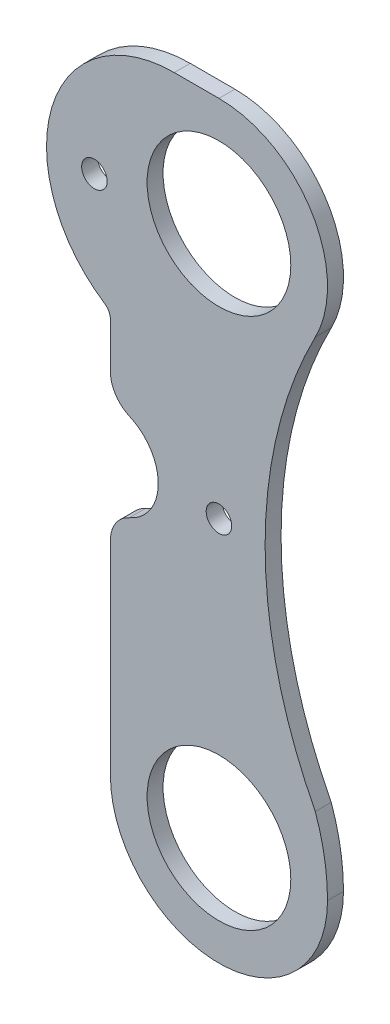
ISO-10303-21;
HEADER;
FILE_DESCRIPTION(('STEP AP214'),'2;1');
FILE_NAME('part.step','',(''),(''),'','','');
FILE_SCHEMA(('AUTOMOTIVE_DESIGN { 1 0 10303 214 1 1 1 1 }'));
ENDSEC;
DATA;
#1=APPLICATION_CONTEXT('core data for automotive mechanical design processes');
#2=APPLICATION_PROTOCOL_DEFINITION('international standard','automotive_design',2000,#1);
#3=PRODUCT_CONTEXT('',#1,'mechanical');
#4=PRODUCT('Part','Part','',(#3));
#5=PRODUCT_RELATED_PRODUCT_CATEGORY('part','',(#4));
#6=PRODUCT_DEFINITION_FORMATION('','',#4);
#7=PRODUCT_DEFINITION_CONTEXT('part definition',#1,'design');
#8=PRODUCT_DEFINITION('design','',#6,#7);
#9=PRODUCT_DEFINITION_SHAPE('','',#8);
#10=(LENGTH_UNIT() NAMED_UNIT(*) SI_UNIT(.MILLI.,.METRE.));
#11=(NAMED_UNIT(*) PLANE_ANGLE_UNIT() SI_UNIT($,.RADIAN.));
#12=(NAMED_UNIT(*) SI_UNIT($,.STERADIAN.) SOLID_ANGLE_UNIT());
#13=UNCERTAINTY_MEASURE_WITH_UNIT(LENGTH_MEASURE(1.E-05),#10,'distance_accuracy_value','');
#14=(GEOMETRIC_REPRESENTATION_CONTEXT(3) GLOBAL_UNCERTAINTY_ASSIGNED_CONTEXT((#13)) GLOBAL_UNIT_ASSIGNED_CONTEXT((#10,
#11,#12)) REPRESENTATION_CONTEXT('',''));
#15=CARTESIAN_POINT('',(0.,0.,0.));
#16=DIRECTION('',(0.,0.,1.));
#17=DIRECTION('',(1.,0.,0.));
#18=AXIS2_PLACEMENT_3D('',#15,#16,#17);
#19=CARTESIAN_POINT('',(0.,0.,3.175));
#20=DIRECTION('',(0.,0.,-1.));
#21=DIRECTION('',(-1.,0.,0.));
#22=AXIS2_PLACEMENT_3D('',#19,#20,#21);
#23=CYLINDRICAL_SURFACE('',#22,21.59);
#24=CARTESIAN_POINT('',(0.,0.,0.));
#25=DIRECTION('',(0.,0.,-1.));
#26=DIRECTION('',(-1.,0.,0.));
#27=AXIS2_PLACEMENT_3D('',#24,#25,#26);
#28=CIRCLE('',#27,21.59);
#29=CARTESIAN_POINT('',(0.,21.59,0.));
#30=VERTEX_POINT('',#29);
#31=CARTESIAN_POINT('',(19.1590830035103,-9.9527703914339,0.));
#32=VERTEX_POINT('',#31);
#33=EDGE_CURVE('E240',#30,#32,#28,.T.);
#34=ORIENTED_EDGE('',*,*,#33,.F.);
#35=DIRECTION('',(0.,0.,1.));
#36=VECTOR('',#35,1.);
#37=CARTESIAN_POINT('',(0.,21.59,0.));
#38=LINE('',#37,#36);
#39=CARTESIAN_POINT('',(0.,21.59,3.175));
#40=VERTEX_POINT('',#39);
#41=EDGE_CURVE('E221',#30,#40,#38,.T.);
#42=ORIENTED_EDGE('',*,*,#41,.T.);
#43=CARTESIAN_POINT('',(0.,0.,3.175));
#44=DIRECTION('',(0.,0.,-1.));
#45=DIRECTION('',(-1.,0.,0.));
#46=AXIS2_PLACEMENT_3D('',#43,#44,#45);
#47=CIRCLE('',#46,21.59);
#48=CARTESIAN_POINT('',(19.1590830035103,-9.9527703914339,3.175));
#49=VERTEX_POINT('',#48);
#50=EDGE_CURVE('E239',#40,#49,#47,.T.);
#51=ORIENTED_EDGE('',*,*,#50,.T.);
#52=DIRECTION('',(0.,0.,-1.));
#53=VECTOR('',#52,1.);
#54=CARTESIAN_POINT('',(19.1590830035103,-9.9527703914339,3.175));
#55=LINE('',#54,#53);
#56=EDGE_CURVE('E248',#49,#32,#55,.T.);
#57=ORIENTED_EDGE('',*,*,#56,.T.);
#58=EDGE_LOOP('',(#34,#42,#51,#57));
#59=FACE_BOUND('',#58,.T.);
#60=ADVANCED_FACE('F73',(#59),#23,.T.);
#61=CARTESIAN_POINT('',(8.89000000000001,12.7,3.175));
#62=DIRECTION('',(0.,0.,-1.));
#63=DIRECTION('',(-1.,0.,0.));
#64=AXIS2_PLACEMENT_3D('',#61,#62,#63);
#65=PLANE('',#64);
#66=CARTESIAN_POINT('',(0.,-105.77576,3.175));
#67=DIRECTION('',(0.,0.,1.));
#68=DIRECTION('',(1.,0.,0.));
#69=AXIS2_PLACEMENT_3D('',#66,#67,#68);
#70=CIRCLE('',#69,14.2875);
#71=CARTESIAN_POINT('',(14.2875,-105.77576,3.175));
#72=VERTEX_POINT('',#71);
#73=EDGE_CURVE('E354',#72,#72,#70,.T.);
#74=ORIENTED_EDGE('',*,*,#73,.F.);
#75=EDGE_LOOP('',(#74));
#76=FACE_BOUND('',#75,.T.);
#77=CARTESIAN_POINT('',(0.,-105.77576,3.175));
#78=DIRECTION('',(0.,0.,1.));
#79=DIRECTION('',(1.,0.,0.));
#80=AXIS2_PLACEMENT_3D('',#77,#78,#79);
#81=CIRCLE('',#80,21.59);
#82=CARTESIAN_POINT('',(-21.59,-105.77576,3.175));
#83=VERTEX_POINT('',#82);
#84=CARTESIAN_POINT('',(21.59,-105.77576,3.175));
#85=VERTEX_POINT('',#84);
#86=EDGE_CURVE('E185',#83,#85,#81,.T.);
#87=ORIENTED_EDGE('',*,*,#86,.T.);
#88=CARTESIAN_POINT('',(-20.6830864036648,-105.77576,3.175));
#89=DIRECTION('',(0.,0.,-1.));
#90=DIRECTION('',(-1.,0.,0.));
#91=AXIS2_PLACEMENT_3D('',#88,#89,#90);
#92=CIRCLE('',#91,42.2730864036648);
#93=CARTESIAN_POINT('',(19.1590830035103,-91.6472296085661,3.175));
#94=VERTEX_POINT('',#93);
#95=EDGE_CURVE('E166',#94,#85,#92,.T.);
#96=ORIENTED_EDGE('',*,*,#95,.F.);
#97=CARTESIAN_POINT('',(97.79,-50.8,3.175));
#98=DIRECTION('',(0.,0.,-1.));
#99=DIRECTION('',(-1.,0.,0.));
#100=AXIS2_PLACEMENT_3D('',#97,#98,#99);
#101=CIRCLE('',#100,88.6076592310381);
#102=EDGE_CURVE('E235',#94,#49,#101,.T.);
#103=ORIENTED_EDGE('',*,*,#102,.T.);
#104=ORIENTED_EDGE('',*,*,#50,.F.);
#105=DIRECTION('',(1.,0.,0.));
#106=VECTOR('',#105,1.);
#107=CARTESIAN_POINT('',(0.,21.59,3.175));
#108=LINE('',#107,#106);
#109=CARTESIAN_POINT('',(-8.89,21.59,3.175));
#110=VERTEX_POINT('',#109);
#111=EDGE_CURVE('E215',#110,#40,#108,.T.);
#112=ORIENTED_EDGE('',*,*,#111,.F.);
#113=CARTESIAN_POINT('',(-8.89,-3.81,3.175));
#114=DIRECTION('',(0.,0.,1.));
#115=DIRECTION('',(1.,0.,0.));
#116=AXIS2_PLACEMENT_3D('',#113,#114,#115);
#117=CIRCLE('',#116,25.4);
#118=CARTESIAN_POINT('',(-22.7445454545454,-25.0987662922945,3.175));
#119=VERTEX_POINT('',#118);
#120=EDGE_CURVE('E203',#110,#119,#117,.T.);
#121=ORIENTED_EDGE('',*,*,#120,.T.);
#122=CARTESIAN_POINT('',(-24.13,-27.2276429215239,3.175));
#123=DIRECTION('',(0.,0.,-1.));
#124=DIRECTION('',(-1.,0.,0.));
#125=AXIS2_PLACEMENT_3D('',#122,#123,#124);
#126=CIRCLE('',#125,2.54);
#127=CARTESIAN_POINT('',(-21.59,-27.2276429215239,3.175));
#128=VERTEX_POINT('',#127);
#129=EDGE_CURVE('E82',#119,#128,#126,.T.);
#130=ORIENTED_EDGE('',*,*,#129,.T.);
#131=DIRECTION('',(0.,-1.,0.));
#132=VECTOR('',#131,1.);
#133=CARTESIAN_POINT('',(-21.59,12.7,3.175));
#134=LINE('',#133,#132);
#135=CARTESIAN_POINT('',(-21.59,-36.2503221685152,3.175));
#136=VERTEX_POINT('',#135);
#137=EDGE_CURVE('E271',#128,#136,#134,.T.);
#138=ORIENTED_EDGE('',*,*,#137,.T.);
#139=CARTESIAN_POINT('',(-15.24,-36.2503221685152,3.175));
#140=DIRECTION('',(0.,0.,-1.));
#141=DIRECTION('',(-1.,0.,0.));
#142=AXIS2_PLACEMENT_3D('',#139,#140,#141);
#143=CIRCLE('',#142,6.35);
#144=CARTESIAN_POINT('',(-17.78,-42.0701933011091,3.175));
#145=VERTEX_POINT('',#144);
#146=EDGE_CURVE('E299',#136,#145,#143,.F.);
#147=ORIENTED_EDGE('',*,*,#146,.T.);
#148=CARTESIAN_POINT('',(-21.59,-50.8,3.175));
#149=DIRECTION('',(0.,0.,1.));
#150=DIRECTION('',(1.,0.,0.));
#151=AXIS2_PLACEMENT_3D('',#148,#149,#150);
#152=CIRCLE('',#151,9.525);
#153=CARTESIAN_POINT('',(-17.78,-59.5298066988909,3.175));
#154=VERTEX_POINT('',#153);
#155=EDGE_CURVE('E225',#154,#145,#152,.T.);
#156=ORIENTED_EDGE('',*,*,#155,.F.);
#157=CARTESIAN_POINT('',(-15.24,-65.3496778314848,3.175));
#158=DIRECTION('',(0.,0.,-1.));
#159=DIRECTION('',(-1.,0.,0.));
#160=AXIS2_PLACEMENT_3D('',#157,#158,#159);
#161=CIRCLE('',#160,6.35);
#162=CARTESIAN_POINT('',(-21.59,-65.3496778314848,3.175));
#163=VERTEX_POINT('',#162);
#164=EDGE_CURVE('E296',#154,#163,#161,.F.);
#165=ORIENTED_EDGE('',*,*,#164,.T.);
#166=EDGE_CURVE('E275',#163,#83,#134,.T.);
#167=ORIENTED_EDGE('',*,*,#166,.T.);
#168=EDGE_LOOP('',(#87,#96,#103,#104,#112,#121,#130,#138,#147,#156,#165,#167));
#169=FACE_BOUND('',#168,.T.);
#170=CARTESIAN_POINT('',(-24.765,-3.81,3.175));
#171=DIRECTION('',(0.,0.,1.));
#172=DIRECTION('',(1.,0.,0.));
#173=AXIS2_PLACEMENT_3D('',#170,#171,#172);
#174=CIRCLE('',#173,2.54);
#175=CARTESIAN_POINT('',(-22.225,-3.81,3.175));
#176=VERTEX_POINT('',#175);
#177=EDGE_CURVE('E172',#176,#176,#174,.T.);
#178=ORIENTED_EDGE('',*,*,#177,.F.);
#179=EDGE_LOOP('',(#178));
#180=FACE_BOUND('',#179,.T.);
#181=CARTESIAN_POINT('',(0.,-50.8,3.175));
#182=DIRECTION('',(0.,0.,1.));
#183=DIRECTION('',(1.,0.,0.));
#184=AXIS2_PLACEMENT_3D('',#181,#182,#183);
#185=CIRCLE('',#184,2.54);
#186=CARTESIAN_POINT('',(2.54000000000001,-50.8,3.175));
#187=VERTEX_POINT('',#186);
#188=EDGE_CURVE('E255',#187,#187,#185,.T.);
#189=ORIENTED_EDGE('',*,*,#188,.F.);
#190=EDGE_LOOP('',(#189));
#191=FACE_BOUND('',#190,.T.);
#192=CARTESIAN_POINT('',(0.,0.,3.175));
#193=DIRECTION('',(0.,0.,1.));
#194=DIRECTION('',(1.,0.,0.));
#195=AXIS2_PLACEMENT_3D('',#192,#193,#194);
#196=CIRCLE('',#195,14.2875);
#197=CARTESIAN_POINT('',(14.2875,0.,3.175));
#198=VERTEX_POINT('',#197);
#199=EDGE_CURVE('E263',#198,#198,#196,.T.);
#200=ORIENTED_EDGE('',*,*,#199,.F.);
#201=EDGE_LOOP('',(#200));
#202=FACE_BOUND('',#201,.T.);
#203=ADVANCED_FACE('F327',(#76,#169,#180,#191,#202),#65,.F.);
#204=CARTESIAN_POINT('',(8.89000000000001,12.7,0.));
#205=DIRECTION('',(0.,0.,-1.));
#206=DIRECTION('',(-1.,0.,0.));
#207=AXIS2_PLACEMENT_3D('',#204,#205,#206);
#208=PLANE('',#207);
#209=CARTESIAN_POINT('',(0.,-105.77576,0.));
#210=DIRECTION('',(0.,0.,1.));
#211=DIRECTION('',(1.,0.,0.));
#212=AXIS2_PLACEMENT_3D('',#209,#210,#211);
#213=CIRCLE('',#212,14.2875);
#214=CARTESIAN_POINT('',(14.2875,-105.77576,0.));
#215=VERTEX_POINT('',#214);
#216=EDGE_CURVE('E351',#215,#215,#213,.T.);
#217=ORIENTED_EDGE('',*,*,#216,.T.);
#218=EDGE_LOOP('',(#217));
#219=FACE_BOUND('',#218,.T.);
#220=CARTESIAN_POINT('',(-20.6830864036648,-105.77576,0.));
#221=DIRECTION('',(0.,0.,-1.));
#222=DIRECTION('',(-1.,0.,0.));
#223=AXIS2_PLACEMENT_3D('',#220,#221,#222);
#224=CIRCLE('',#223,42.2730864036648);
#225=CARTESIAN_POINT('',(19.1590830035103,-91.6472296085661,0.));
#226=VERTEX_POINT('',#225);
#227=CARTESIAN_POINT('',(21.59,-105.77576,0.));
#228=VERTEX_POINT('',#227);
#229=EDGE_CURVE('E163',#226,#228,#224,.T.);
#230=ORIENTED_EDGE('',*,*,#229,.T.);
#231=CARTESIAN_POINT('',(0.,-105.77576,0.));
#232=DIRECTION('',(0.,0.,1.));
#233=DIRECTION('',(1.,0.,0.));
#234=AXIS2_PLACEMENT_3D('',#231,#232,#233);
#235=CIRCLE('',#234,21.59);
#236=CARTESIAN_POINT('',(-21.59,-105.77576,0.));
#237=VERTEX_POINT('',#236);
#238=EDGE_CURVE('E181',#237,#228,#235,.T.);
#239=ORIENTED_EDGE('',*,*,#238,.F.);
#240=DIRECTION('',(0.,-1.,0.));
#241=VECTOR('',#240,1.);
#242=CARTESIAN_POINT('',(-21.59,12.7,0.));
#243=LINE('',#242,#241);
#244=CARTESIAN_POINT('',(-21.59,-65.3496778314848,0.));
#245=VERTEX_POINT('',#244);
#246=EDGE_CURVE('E267',#245,#237,#243,.T.);
#247=ORIENTED_EDGE('',*,*,#246,.F.);
#248=CARTESIAN_POINT('',(-15.24,-65.3496778314848,0.));
#249=DIRECTION('',(0.,0.,-1.));
#250=DIRECTION('',(-1.,0.,0.));
#251=AXIS2_PLACEMENT_3D('',#248,#249,#250);
#252=CIRCLE('',#251,6.35);
#253=CARTESIAN_POINT('',(-17.78,-59.5298066988909,0.));
#254=VERTEX_POINT('',#253);
#255=EDGE_CURVE('E285',#245,#254,#252,.T.);
#256=ORIENTED_EDGE('',*,*,#255,.T.);
#257=CARTESIAN_POINT('',(-21.59,-50.8,0.));
#258=DIRECTION('',(0.,0.,1.));
#259=DIRECTION('',(1.,0.,0.));
#260=AXIS2_PLACEMENT_3D('',#257,#258,#259);
#261=CIRCLE('',#260,9.525);
#262=CARTESIAN_POINT('',(-17.78,-42.0701933011091,0.));
#263=VERTEX_POINT('',#262);
#264=EDGE_CURVE('E228',#254,#263,#261,.T.);
#265=ORIENTED_EDGE('',*,*,#264,.T.);
#266=CARTESIAN_POINT('',(-15.24,-36.2503221685152,0.));
#267=DIRECTION('',(0.,0.,-1.));
#268=DIRECTION('',(-1.,0.,0.));
#269=AXIS2_PLACEMENT_3D('',#266,#267,#268);
#270=CIRCLE('',#269,6.35);
#271=CARTESIAN_POINT('',(-21.59,-36.2503221685152,0.));
#272=VERTEX_POINT('',#271);
#273=EDGE_CURVE('E288',#263,#272,#270,.T.);
#274=ORIENTED_EDGE('',*,*,#273,.T.);
#275=CARTESIAN_POINT('',(-21.59,-27.2276429215239,0.));
#276=VERTEX_POINT('',#275);
#277=EDGE_CURVE('E276',#276,#272,#243,.T.);
#278=ORIENTED_EDGE('',*,*,#277,.F.);
#279=CARTESIAN_POINT('',(-24.13,-27.2276429215239,0.));
#280=DIRECTION('',(0.,0.,-1.));
#281=DIRECTION('',(-1.,0.,0.));
#282=AXIS2_PLACEMENT_3D('',#279,#280,#281);
#283=CIRCLE('',#282,2.54);
#284=CARTESIAN_POINT('',(-22.7445454545454,-25.0987662922945,0.));
#285=VERTEX_POINT('',#284);
#286=EDGE_CURVE('E12',#276,#285,#283,.F.);
#287=ORIENTED_EDGE('',*,*,#286,.T.);
#288=CARTESIAN_POINT('',(-8.89,-3.81,0.));
#289=DIRECTION('',(0.,0.,1.));
#290=DIRECTION('',(1.,0.,0.));
#291=AXIS2_PLACEMENT_3D('',#288,#289,#290);
#292=CIRCLE('',#291,25.4);
#293=CARTESIAN_POINT('',(-8.89,21.59,0.));
#294=VERTEX_POINT('',#293);
#295=EDGE_CURVE('E207',#294,#285,#292,.T.);
#296=ORIENTED_EDGE('',*,*,#295,.F.);
#297=DIRECTION('',(1.,0.,0.));
#298=VECTOR('',#297,1.);
#299=CARTESIAN_POINT('',(0.,21.59,0.));
#300=LINE('',#299,#298);
#301=EDGE_CURVE('E202',#294,#30,#300,.T.);
#302=ORIENTED_EDGE('',*,*,#301,.T.);
#303=ORIENTED_EDGE('',*,*,#33,.T.);
#304=CARTESIAN_POINT('',(97.79,-50.8,0.));
#305=DIRECTION('',(0.,0.,-1.));
#306=DIRECTION('',(-1.,0.,0.));
#307=AXIS2_PLACEMENT_3D('',#304,#305,#306);
#308=CIRCLE('',#307,88.6076592310381);
#309=EDGE_CURVE('E183',#226,#32,#308,.T.);
#310=ORIENTED_EDGE('',*,*,#309,.F.);
#311=EDGE_LOOP('',(#230,#239,#247,#256,#265,#274,#278,#287,#296,#302,#303,#310));
#312=FACE_BOUND('',#311,.T.);
#313=CARTESIAN_POINT('',(0.,-50.8,0.));
#314=DIRECTION('',(0.,0.,1.));
#315=DIRECTION('',(1.,0.,0.));
#316=AXIS2_PLACEMENT_3D('',#313,#314,#315);
#317=CIRCLE('',#316,2.54);
#318=CARTESIAN_POINT('',(2.54000000000001,-50.8,0.));
#319=VERTEX_POINT('',#318);
#320=EDGE_CURVE('E252',#319,#319,#317,.T.);
#321=ORIENTED_EDGE('',*,*,#320,.T.);
#322=EDGE_LOOP('',(#321));
#323=FACE_BOUND('',#322,.T.);
#324=CARTESIAN_POINT('',(0.,0.,0.));
#325=DIRECTION('',(0.,0.,1.));
#326=DIRECTION('',(1.,0.,0.));
#327=AXIS2_PLACEMENT_3D('',#324,#325,#326);
#328=CIRCLE('',#327,14.2875);
#329=CARTESIAN_POINT('',(14.2875,0.,0.));
#330=VERTEX_POINT('',#329);
#331=EDGE_CURVE('E259',#330,#330,#328,.T.);
#332=ORIENTED_EDGE('',*,*,#331,.T.);
#333=EDGE_LOOP('',(#332));
#334=FACE_BOUND('',#333,.T.);
#335=CARTESIAN_POINT('',(-24.765,-3.81,0.));
#336=DIRECTION('',(0.,0.,1.));
#337=DIRECTION('',(1.,0.,0.));
#338=AXIS2_PLACEMENT_3D('',#335,#336,#337);
#339=CIRCLE('',#338,2.54);
#340=CARTESIAN_POINT('',(-22.225,-3.81,0.));
#341=VERTEX_POINT('',#340);
#342=EDGE_CURVE('E198',#341,#341,#339,.T.);
#343=ORIENTED_EDGE('',*,*,#342,.T.);
#344=EDGE_LOOP('',(#343));
#345=FACE_BOUND('',#344,.T.);
#346=ADVANCED_FACE('F178',(#219,#312,#323,#334,#345),#208,.T.);
#347=CARTESIAN_POINT('',(-21.59,12.7,3.175));
#348=DIRECTION('',(1.,0.,0.));
#349=DIRECTION('',(0.,1.,0.));
#350=AXIS2_PLACEMENT_3D('',#347,#348,#349);
#351=PLANE('',#350);
#352=ORIENTED_EDGE('',*,*,#246,.T.);
#353=DIRECTION('',(0.,0.,1.));
#354=VECTOR('',#353,1.);
#355=CARTESIAN_POINT('',(-21.59,-105.77576,0.));
#356=LINE('',#355,#354);
#357=EDGE_CURVE('E173',#237,#83,#356,.T.);
#358=ORIENTED_EDGE('',*,*,#357,.T.);
#359=ORIENTED_EDGE('',*,*,#166,.F.);
#360=DIRECTION('',(0.,0.,1.));
#361=VECTOR('',#360,1.);
#362=CARTESIAN_POINT('',(-21.59,-65.3496778314848,0.));
#363=LINE('',#362,#361);
#364=EDGE_CURVE('E302',#163,#245,#363,.F.);
#365=ORIENTED_EDGE('',*,*,#364,.T.);
#366=EDGE_LOOP('',(#352,#358,#359,#365));
#367=FACE_BOUND('',#366,.T.);
#368=ADVANCED_FACE('F315',(#367),#351,.F.);
#369=ORIENTED_EDGE('',*,*,#137,.F.);
#370=DIRECTION('',(0.,0.,1.));
#371=VECTOR('',#370,1.);
#372=CARTESIAN_POINT('',(-21.59,-27.2276429215239,3.175));
#373=LINE('',#372,#371);
#374=EDGE_CURVE('E89',#128,#276,#373,.F.);
#375=ORIENTED_EDGE('',*,*,#374,.T.);
#376=ORIENTED_EDGE('',*,*,#277,.T.);
#377=DIRECTION('',(0.,0.,1.));
#378=VECTOR('',#377,1.);
#379=CARTESIAN_POINT('',(-21.59,-36.2503221685152,3.175));
#380=LINE('',#379,#378);
#381=EDGE_CURVE('E292',#272,#136,#380,.T.);
#382=ORIENTED_EDGE('',*,*,#381,.T.);
#383=EDGE_LOOP('',(#369,#375,#376,#382));
#384=FACE_BOUND('',#383,.T.);
#385=ADVANCED_FACE('F380',(#384),#351,.F.);
#386=CARTESIAN_POINT('',(0.,0.,3.175));
#387=DIRECTION('',(0.,0.,-1.));
#388=DIRECTION('',(-1.,0.,0.));
#389=AXIS2_PLACEMENT_3D('',#386,#387,#388);
#390=CYLINDRICAL_SURFACE('',#389,14.2875);
#391=ORIENTED_EDGE('',*,*,#199,.T.);
#392=EDGE_LOOP('',(#391));
#393=FACE_BOUND('',#392,.T.);
#394=ORIENTED_EDGE('',*,*,#331,.F.);
#395=EDGE_LOOP('',(#394));
#396=FACE_BOUND('',#395,.T.);
#397=ADVANCED_FACE('F375',(#393,#396),#390,.F.);
#398=CARTESIAN_POINT('',(0.,-50.8,3.175));
#399=DIRECTION('',(0.,0.,-1.));
#400=DIRECTION('',(-1.,0.,0.));
#401=AXIS2_PLACEMENT_3D('',#398,#399,#400);
#402=CYLINDRICAL_SURFACE('',#401,2.54);
#403=ORIENTED_EDGE('',*,*,#188,.T.);
#404=EDGE_LOOP('',(#403));
#405=FACE_BOUND('',#404,.T.);
#406=ORIENTED_EDGE('',*,*,#320,.F.);
#407=EDGE_LOOP('',(#406));
#408=FACE_BOUND('',#407,.T.);
#409=ADVANCED_FACE('F399',(#405,#408),#402,.F.);
#410=CARTESIAN_POINT('',(97.79,-50.8,3.175));
#411=DIRECTION('',(0.,0.,-1.));
#412=DIRECTION('',(-1.,0.,0.));
#413=AXIS2_PLACEMENT_3D('',#410,#411,#412);
#414=CYLINDRICAL_SURFACE('',#413,88.6076592310381);
#415=ORIENTED_EDGE('',*,*,#309,.T.);
#416=ORIENTED_EDGE('',*,*,#56,.F.);
#417=ORIENTED_EDGE('',*,*,#102,.F.);
#418=DIRECTION('',(0.,0.,-1.));
#419=VECTOR('',#418,1.);
#420=CARTESIAN_POINT('',(19.1590830035103,-91.6472296085661,3.175));
#421=LINE('',#420,#419);
#422=EDGE_CURVE('E243',#94,#226,#421,.T.);
#423=ORIENTED_EDGE('',*,*,#422,.T.);
#424=EDGE_LOOP('',(#415,#416,#417,#423));
#425=FACE_BOUND('',#424,.T.);
#426=ADVANCED_FACE('F349',(#425),#414,.F.);
#427=CARTESIAN_POINT('',(-21.59,-50.8,3.175));
#428=DIRECTION('',(0.,0.,-1.));
#429=DIRECTION('',(-1.,0.,0.));
#430=AXIS2_PLACEMENT_3D('',#427,#428,#429);
#431=CYLINDRICAL_SURFACE('',#430,9.525);
#432=ORIENTED_EDGE('',*,*,#155,.T.);
#433=DIRECTION('',(0.,0.,-1.));
#434=VECTOR('',#433,1.);
#435=CARTESIAN_POINT('',(-17.78,-42.0701933011091,3.175));
#436=LINE('',#435,#434);
#437=EDGE_CURVE('E281',#145,#263,#436,.T.);
#438=ORIENTED_EDGE('',*,*,#437,.T.);
#439=ORIENTED_EDGE('',*,*,#264,.F.);
#440=DIRECTION('',(0.,0.,-1.));
#441=VECTOR('',#440,1.);
#442=CARTESIAN_POINT('',(-17.78,-59.5298066988909,3.175));
#443=LINE('',#442,#441);
#444=EDGE_CURVE('E274',#254,#154,#443,.F.);
#445=ORIENTED_EDGE('',*,*,#444,.T.);
#446=EDGE_LOOP('',(#432,#438,#439,#445));
#447=FACE_BOUND('',#446,.T.);
#448=ADVANCED_FACE('F322',(#447),#431,.F.);
#449=CARTESIAN_POINT('',(-15.24,-36.2503221685152,3.175));
#450=DIRECTION('',(0.,0.,-1.));
#451=DIRECTION('',(-1.,0.,0.));
#452=AXIS2_PLACEMENT_3D('',#449,#450,#451);
#453=CYLINDRICAL_SURFACE('',#452,6.35);
#454=ORIENTED_EDGE('',*,*,#146,.F.);
#455=ORIENTED_EDGE('',*,*,#381,.F.);
#456=ORIENTED_EDGE('',*,*,#273,.F.);
#457=ORIENTED_EDGE('',*,*,#437,.F.);
#458=EDGE_LOOP('',(#454,#455,#456,#457));
#459=FACE_BOUND('',#458,.T.);
#460=ADVANCED_FACE('F331',(#459),#453,.T.);
#461=CARTESIAN_POINT('',(-15.24,-65.3496778314848,3.175));
#462=DIRECTION('',(0.,0.,-1.));
#463=DIRECTION('',(-1.,0.,0.));
#464=AXIS2_PLACEMENT_3D('',#461,#462,#463);
#465=CYLINDRICAL_SURFACE('',#464,6.35);
#466=ORIENTED_EDGE('',*,*,#164,.F.);
#467=ORIENTED_EDGE('',*,*,#444,.F.);
#468=ORIENTED_EDGE('',*,*,#255,.F.);
#469=ORIENTED_EDGE('',*,*,#364,.F.);
#470=EDGE_LOOP('',(#466,#467,#468,#469));
#471=FACE_BOUND('',#470,.T.);
#472=ADVANCED_FACE('F326',(#471),#465,.T.);
#473=CARTESIAN_POINT('',(0.,21.59,0.));
#474=DIRECTION('',(0.,-1.,0.));
#475=DIRECTION('',(0.,0.,-1.));
#476=AXIS2_PLACEMENT_3D('',#473,#474,#475);
#477=PLANE('',#476);
#478=ORIENTED_EDGE('',*,*,#111,.T.);
#479=ORIENTED_EDGE('',*,*,#41,.F.);
#480=ORIENTED_EDGE('',*,*,#301,.F.);
#481=DIRECTION('',(0.,0.,1.));
#482=VECTOR('',#481,1.);
#483=CARTESIAN_POINT('',(-8.89,21.59,0.));
#484=LINE('',#483,#482);
#485=EDGE_CURVE('E211',#294,#110,#484,.T.);
#486=ORIENTED_EDGE('',*,*,#485,.T.);
#487=EDGE_LOOP('',(#478,#479,#480,#486));
#488=FACE_BOUND('',#487,.T.);
#489=ADVANCED_FACE('F343',(#488),#477,.F.);
#490=CARTESIAN_POINT('',(-24.765,-3.81,0.));
#491=DIRECTION('',(0.,0.,1.));
#492=DIRECTION('',(1.,0.,0.));
#493=AXIS2_PLACEMENT_3D('',#490,#491,#492);
#494=CYLINDRICAL_SURFACE('',#493,2.54);
#495=ORIENTED_EDGE('',*,*,#342,.F.);
#496=EDGE_LOOP('',(#495));
#497=FACE_BOUND('',#496,.T.);
#498=ORIENTED_EDGE('',*,*,#177,.T.);
#499=EDGE_LOOP('',(#498));
#500=FACE_BOUND('',#499,.T.);
#501=ADVANCED_FACE('F386',(#497,#500),#494,.F.);
#502=CARTESIAN_POINT('',(-8.89,-3.81,0.));
#503=DIRECTION('',(0.,0.,1.));
#504=DIRECTION('',(1.,0.,0.));
#505=AXIS2_PLACEMENT_3D('',#502,#503,#504);
#506=CYLINDRICAL_SURFACE('',#505,25.4);
#507=ORIENTED_EDGE('',*,*,#295,.T.);
#508=DIRECTION('',(0.,0.,1.));
#509=VECTOR('',#508,1.);
#510=CARTESIAN_POINT('',(-22.7445454545455,-25.0987662922945,0.));
#511=LINE('',#510,#509);
#512=EDGE_CURVE('E306',#285,#119,#511,.T.);
#513=ORIENTED_EDGE('',*,*,#512,.T.);
#514=ORIENTED_EDGE('',*,*,#120,.F.);
#515=ORIENTED_EDGE('',*,*,#485,.F.);
#516=EDGE_LOOP('',(#507,#513,#514,#515));
#517=FACE_BOUND('',#516,.T.);
#518=ADVANCED_FACE('F339',(#517),#506,.T.);
#519=CARTESIAN_POINT('',(-24.13,-27.2276429215239,0.));
#520=DIRECTION('',(0.,0.,1.));
#521=DIRECTION('',(1.,0.,0.));
#522=AXIS2_PLACEMENT_3D('',#519,#520,#521);
#523=CYLINDRICAL_SURFACE('',#522,2.54);
#524=ORIENTED_EDGE('',*,*,#286,.F.);
#525=ORIENTED_EDGE('',*,*,#374,.F.);
#526=ORIENTED_EDGE('',*,*,#129,.F.);
#527=ORIENTED_EDGE('',*,*,#512,.F.);
#528=EDGE_LOOP('',(#524,#525,#526,#527));
#529=FACE_BOUND('',#528,.T.);
#530=ADVANCED_FACE('F75',(#529),#523,.F.);
#531=CARTESIAN_POINT('',(0.,-105.77576,0.));
#532=DIRECTION('',(0.,0.,1.));
#533=DIRECTION('',(1.,0.,0.));
#534=AXIS2_PLACEMENT_3D('',#531,#532,#533);
#535=CYLINDRICAL_SURFACE('',#534,21.59);
#536=ORIENTED_EDGE('',*,*,#86,.F.);
#537=ORIENTED_EDGE('',*,*,#357,.F.);
#538=ORIENTED_EDGE('',*,*,#238,.T.);
#539=DIRECTION('',(0.,0.,1.));
#540=VECTOR('',#539,1.);
#541=CARTESIAN_POINT('',(21.59,-105.77576,0.));
#542=LINE('',#541,#540);
#543=EDGE_CURVE('E160',#228,#85,#542,.T.);
#544=ORIENTED_EDGE('',*,*,#543,.T.);
#545=EDGE_LOOP('',(#536,#537,#538,#544));
#546=FACE_BOUND('',#545,.T.);
#547=ADVANCED_FACE('F188',(#546),#535,.T.);
#548=CARTESIAN_POINT('',(-20.6830864036648,-105.77576,0.));
#549=DIRECTION('',(0.,0.,1.));
#550=DIRECTION('',(1.,0.,0.));
#551=AXIS2_PLACEMENT_3D('',#548,#549,#550);
#552=CYLINDRICAL_SURFACE('',#551,42.2730864036648);
#553=ORIENTED_EDGE('',*,*,#95,.T.);
#554=ORIENTED_EDGE('',*,*,#543,.F.);
#555=ORIENTED_EDGE('',*,*,#229,.F.);
#556=ORIENTED_EDGE('',*,*,#422,.F.);
#557=EDGE_LOOP('',(#553,#554,#555,#556));
#558=FACE_BOUND('',#557,.T.);
#559=ADVANCED_FACE('F162',(#558),#552,.T.);
#560=CARTESIAN_POINT('',(0.,-105.77576,0.));
#561=DIRECTION('',(0.,0.,1.));
#562=DIRECTION('',(1.,0.,0.));
#563=AXIS2_PLACEMENT_3D('',#560,#561,#562);
#564=CYLINDRICAL_SURFACE('',#563,14.2875);
#565=ORIENTED_EDGE('',*,*,#216,.F.);
#566=EDGE_LOOP('',(#565));
#567=FACE_BOUND('',#566,.T.);
#568=ORIENTED_EDGE('',*,*,#73,.T.);
#569=EDGE_LOOP('',(#568));
#570=FACE_BOUND('',#569,.T.);
#571=ADVANCED_FACE('F363',(#567,#570),#564,.F.);
#572=CLOSED_SHELL('',(#60,#203,#346,#368,#385,#397,#409,#426,#448,#460,#472,#489,#501,#518,#530,
#547,#559,#571));
#573=MANIFOLD_SOLID_BREP('B2',#572);
#574=ADVANCED_BREP_SHAPE_REPRESENTATION('',(#18,#573),#14);
#575=SHAPE_DEFINITION_REPRESENTATION(#9,#574);
ENDSEC;
END-ISO-10303-21;
